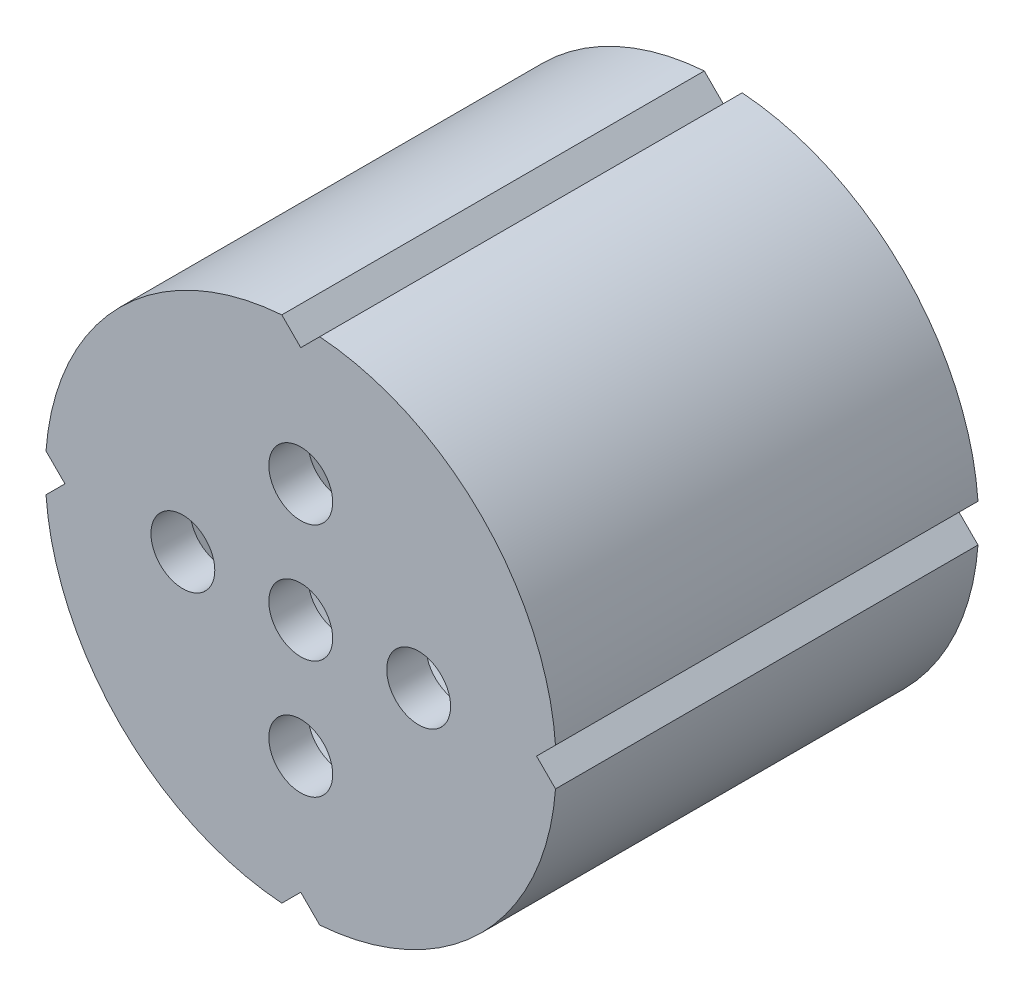
ISO-10303-21;
HEADER;
FILE_DESCRIPTION(('STEP AP214'),'2;1');
FILE_NAME('part.step','',(''),(''),'','','');
FILE_SCHEMA(('AUTOMOTIVE_DESIGN { 1 0 10303 214 1 1 1 1 }'));
ENDSEC;
DATA;
#1=APPLICATION_CONTEXT('core data for automotive mechanical design processes');
#2=APPLICATION_PROTOCOL_DEFINITION('international standard','automotive_design',2000,#1);
#3=PRODUCT_CONTEXT('',#1,'mechanical');
#4=PRODUCT('Part','Part','',(#3));
#5=PRODUCT_RELATED_PRODUCT_CATEGORY('part','',(#4));
#6=PRODUCT_DEFINITION_FORMATION('','',#4);
#7=PRODUCT_DEFINITION_CONTEXT('part definition',#1,'design');
#8=PRODUCT_DEFINITION('design','',#6,#7);
#9=PRODUCT_DEFINITION_SHAPE('','',#8);
#10=(LENGTH_UNIT() NAMED_UNIT(*) SI_UNIT(.MILLI.,.METRE.));
#11=(NAMED_UNIT(*) PLANE_ANGLE_UNIT() SI_UNIT($,.RADIAN.));
#12=(NAMED_UNIT(*) SI_UNIT($,.STERADIAN.) SOLID_ANGLE_UNIT());
#13=UNCERTAINTY_MEASURE_WITH_UNIT(LENGTH_MEASURE(1.E-05),#10,'distance_accuracy_value','');
#14=(GEOMETRIC_REPRESENTATION_CONTEXT(3) GLOBAL_UNCERTAINTY_ASSIGNED_CONTEXT((#13)) GLOBAL_UNIT_ASSIGNED_CONTEXT((#10,
#11,#12)) REPRESENTATION_CONTEXT('',''));
#15=CARTESIAN_POINT('',(0.,0.,0.));
#16=DIRECTION('',(0.,0.,1.));
#17=DIRECTION('',(1.,0.,0.));
#18=AXIS2_PLACEMENT_3D('',#15,#16,#17);
#19=CARTESIAN_POINT('',(0.,-12.0000000000006,-19.5));
#20=DIRECTION('',(0.707106781186548,-0.707106781186547,0.));
#21=DIRECTION('',(0.707106781186547,0.707106781186548,0.));
#22=AXIS2_PLACEMENT_3D('',#19,#20,#21);
#23=PLANE('',#22);
#24=DIRECTION('',(0.,0.,1.));
#25=VECTOR('',#24,1.);
#26=CARTESIAN_POINT('',(0.,-12.0000000000006,-19.5));
#27=LINE('',#26,#25);
#28=CARTESIAN_POINT('',(0.,-12.0000000000006,-19.5));
#29=VERTEX_POINT('',#28);
#30=CARTESIAN_POINT('',(0.,-12.0000000000006,2.));
#31=VERTEX_POINT('',#30);
#32=EDGE_CURVE('E36',#29,#31,#27,.T.);
#33=ORIENTED_EDGE('',*,*,#32,.T.);
#34=DIRECTION('',(0.707106781186547,0.707106781186548,0.));
#35=VECTOR('',#34,1.);
#36=CARTESIAN_POINT('',(-0.96419413859206,-12.9641941385926,2.));
#37=LINE('',#36,#35);
#38=CARTESIAN_POINT('',(-0.964194138592055,-12.9641941385926,2.));
#39=VERTEX_POINT('',#38);
#40=EDGE_CURVE('E160',#39,#31,#37,.T.);
#41=ORIENTED_EDGE('',*,*,#40,.F.);
#42=DIRECTION('',(0.,0.,1.));
#43=VECTOR('',#42,1.);
#44=CARTESIAN_POINT('',(-0.96419413859206,-12.9641941385926,-19.5));
#45=LINE('',#44,#43);
#46=CARTESIAN_POINT('',(-0.96419413859206,-12.9641941385926,-19.5));
#47=VERTEX_POINT('',#46);
#48=EDGE_CURVE('E11',#47,#39,#45,.T.);
#49=ORIENTED_EDGE('',*,*,#48,.F.);
#50=DIRECTION('',(0.707106781186547,0.707106781186548,0.));
#51=VECTOR('',#50,1.);
#52=CARTESIAN_POINT('',(0.,-12.0000000000006,-19.5));
#53=LINE('',#52,#51);
#54=EDGE_CURVE('E185',#47,#29,#53,.T.);
#55=ORIENTED_EDGE('',*,*,#54,.T.);
#56=EDGE_LOOP('',(#33,#41,#49,#55));
#57=FACE_BOUND('',#56,.T.);
#58=ADVANCED_FACE('F33',(#57),#23,.T.);
#59=CARTESIAN_POINT('',(0.,0.,-19.5));
#60=DIRECTION('',(0.,0.,1.));
#61=DIRECTION('',(1.,0.,0.));
#62=AXIS2_PLACEMENT_3D('',#59,#60,#61);
#63=CYLINDRICAL_SURFACE('',#62,13.0000000000006);
#64=ORIENTED_EDGE('',*,*,#48,.T.);
#65=CARTESIAN_POINT('',(0.,0.,2.));
#66=DIRECTION('',(0.,0.,1.));
#67=DIRECTION('',(-1.,0.,0.));
#68=AXIS2_PLACEMENT_3D('',#65,#66,#67);
#69=CIRCLE('',#68,13.0000000000006);
#70=CARTESIAN_POINT('',(-12.9641941385926,-0.964194138592061,2.));
#71=VERTEX_POINT('',#70);
#72=EDGE_CURVE('E157',#71,#39,#69,.T.);
#73=ORIENTED_EDGE('',*,*,#72,.F.);
#74=DIRECTION('',(0.,0.,1.));
#75=VECTOR('',#74,1.);
#76=CARTESIAN_POINT('',(-12.9641941385926,-0.964194138592061,-19.5));
#77=LINE('',#76,#75);
#78=CARTESIAN_POINT('',(-12.9641941385926,-0.964194138592061,-19.5));
#79=VERTEX_POINT('',#78);
#80=EDGE_CURVE('E41',#79,#71,#77,.T.);
#81=ORIENTED_EDGE('',*,*,#80,.F.);
#82=CARTESIAN_POINT('',(0.,0.,-19.5));
#83=DIRECTION('',(0.,0.,1.));
#84=DIRECTION('',(1.,0.,0.));
#85=AXIS2_PLACEMENT_3D('',#82,#83,#84);
#86=CIRCLE('',#85,13.0000000000006);
#87=EDGE_CURVE('E215',#79,#47,#86,.T.);
#88=ORIENTED_EDGE('',*,*,#87,.T.);
#89=EDGE_LOOP('',(#64,#73,#81,#88));
#90=FACE_BOUND('',#89,.T.);
#91=ADVANCED_FACE('F249',(#90),#63,.T.);
#92=CARTESIAN_POINT('',(-12.0000000000006,0.,-19.5));
#93=DIRECTION('',(-0.707106781186547,0.707106781186548,0.));
#94=DIRECTION('',(-0.707106781186548,-0.707106781186547,0.));
#95=AXIS2_PLACEMENT_3D('',#92,#93,#94);
#96=PLANE('',#95);
#97=ORIENTED_EDGE('',*,*,#80,.T.);
#98=DIRECTION('',(-0.707106781186548,-0.707106781186547,0.));
#99=VECTOR('',#98,1.);
#100=CARTESIAN_POINT('',(-12.9641941385926,-0.964194138592061,2.));
#101=LINE('',#100,#99);
#102=CARTESIAN_POINT('',(-12.0000000000006,0.,2.));
#103=VERTEX_POINT('',#102);
#104=EDGE_CURVE('E141',#103,#71,#101,.T.);
#105=ORIENTED_EDGE('',*,*,#104,.F.);
#106=DIRECTION('',(0.,0.,1.));
#107=VECTOR('',#106,1.);
#108=CARTESIAN_POINT('',(-12.0000000000006,0.,-19.5));
#109=LINE('',#108,#107);
#110=CARTESIAN_POINT('',(-12.0000000000006,0.,-19.5));
#111=VERTEX_POINT('',#110);
#112=EDGE_CURVE('E132',#111,#103,#109,.T.);
#113=ORIENTED_EDGE('',*,*,#112,.F.);
#114=DIRECTION('',(-0.707106781186548,-0.707106781186547,0.));
#115=VECTOR('',#114,1.);
#116=CARTESIAN_POINT('',(-12.0000000000006,0.,-19.5));
#117=LINE('',#116,#115);
#118=EDGE_CURVE('E213',#111,#79,#117,.T.);
#119=ORIENTED_EDGE('',*,*,#118,.T.);
#120=EDGE_LOOP('',(#97,#105,#113,#119));
#121=FACE_BOUND('',#120,.T.);
#122=ADVANCED_FACE('F253',(#121),#96,.T.);
#123=CARTESIAN_POINT('',(-12.9641941385926,0.964194138592062,-19.5));
#124=DIRECTION('',(-0.707106781186547,-0.707106781186548,0.));
#125=DIRECTION('',(0.707106781186548,-0.707106781186547,0.));
#126=AXIS2_PLACEMENT_3D('',#123,#124,#125);
#127=PLANE('',#126);
#128=ORIENTED_EDGE('',*,*,#112,.T.);
#129=DIRECTION('',(0.707106781186549,-0.707106781186546,0.));
#130=VECTOR('',#129,1.);
#131=CARTESIAN_POINT('',(-12.0000000000006,0.,2.));
#132=LINE('',#131,#130);
#133=CARTESIAN_POINT('',(-12.9641941385926,0.964194138592059,2.));
#134=VERTEX_POINT('',#133);
#135=EDGE_CURVE('E136',#134,#103,#132,.T.);
#136=ORIENTED_EDGE('',*,*,#135,.F.);
#137=DIRECTION('',(0.,0.,1.));
#138=VECTOR('',#137,1.);
#139=CARTESIAN_POINT('',(-12.9641941385926,0.964194138592059,-19.5));
#140=LINE('',#139,#138);
#141=CARTESIAN_POINT('',(-12.9641941385926,0.964194138592059,-19.5));
#142=VERTEX_POINT('',#141);
#143=EDGE_CURVE('E122',#142,#134,#140,.T.);
#144=ORIENTED_EDGE('',*,*,#143,.F.);
#145=DIRECTION('',(0.707106781186548,-0.707106781186547,0.));
#146=VECTOR('',#145,1.);
#147=CARTESIAN_POINT('',(-12.9641941385926,0.964194138592062,-19.5));
#148=LINE('',#147,#146);
#149=EDGE_CURVE('E211',#142,#111,#148,.T.);
#150=ORIENTED_EDGE('',*,*,#149,.T.);
#151=EDGE_LOOP('',(#128,#136,#144,#150));
#152=FACE_BOUND('',#151,.T.);
#153=ADVANCED_FACE('F137',(#152),#127,.T.);
#154=CARTESIAN_POINT('',(0.,0.,-19.5));
#155=DIRECTION('',(0.,0.,1.));
#156=DIRECTION('',(1.,0.,0.));
#157=AXIS2_PLACEMENT_3D('',#154,#155,#156);
#158=CYLINDRICAL_SURFACE('',#157,13.0000000000006);
#159=ORIENTED_EDGE('',*,*,#143,.T.);
#160=CARTESIAN_POINT('',(0.,0.,2.));
#161=DIRECTION('',(0.,0.,1.));
#162=DIRECTION('',(-1.,0.,0.));
#163=AXIS2_PLACEMENT_3D('',#160,#161,#162);
#164=CIRCLE('',#163,13.0000000000005);
#165=CARTESIAN_POINT('',(-0.964194138592062,12.9641941385926,2.));
#166=VERTEX_POINT('',#165);
#167=EDGE_CURVE('E126',#166,#134,#164,.T.);
#168=ORIENTED_EDGE('',*,*,#167,.F.);
#169=DIRECTION('',(0.,0.,1.));
#170=VECTOR('',#169,1.);
#171=CARTESIAN_POINT('',(-0.964194138592062,12.9641941385926,-19.5));
#172=LINE('',#171,#170);
#173=CARTESIAN_POINT('',(-0.964194138592062,12.9641941385926,-19.5));
#174=VERTEX_POINT('',#173);
#175=EDGE_CURVE('E133',#174,#166,#172,.T.);
#176=ORIENTED_EDGE('',*,*,#175,.F.);
#177=CARTESIAN_POINT('',(0.,0.,-19.5));
#178=DIRECTION('',(0.,0.,1.));
#179=DIRECTION('',(1.,0.,0.));
#180=AXIS2_PLACEMENT_3D('',#177,#178,#179);
#181=CIRCLE('',#180,13.0000000000006);
#182=EDGE_CURVE('E128',#174,#142,#181,.T.);
#183=ORIENTED_EDGE('',*,*,#182,.T.);
#184=EDGE_LOOP('',(#159,#168,#176,#183));
#185=FACE_BOUND('',#184,.T.);
#186=ADVANCED_FACE('F124',(#185),#158,.T.);
#187=CARTESIAN_POINT('',(-0.964194138592062,12.9641941385926,-19.5));
#188=DIRECTION('',(0.707106781186548,0.707106781186547,0.));
#189=DIRECTION('',(-0.707106781186547,0.707106781186548,0.));
#190=AXIS2_PLACEMENT_3D('',#187,#188,#189);
#191=PLANE('',#190);
#192=ORIENTED_EDGE('',*,*,#175,.T.);
#193=DIRECTION('',(-0.707106781186547,0.707106781186548,0.));
#194=VECTOR('',#193,1.);
#195=CARTESIAN_POINT('',(-0.964194138592062,12.9641941385926,2.));
#196=LINE('',#195,#194);
#197=CARTESIAN_POINT('',(0.,12.0000000000006,2.));
#198=VERTEX_POINT('',#197);
#199=EDGE_CURVE('E148',#198,#166,#196,.T.);
#200=ORIENTED_EDGE('',*,*,#199,.F.);
#201=DIRECTION('',(0.,0.,1.));
#202=VECTOR('',#201,1.);
#203=CARTESIAN_POINT('',(0.,12.0000000000006,-19.5));
#204=LINE('',#203,#202);
#205=CARTESIAN_POINT('',(0.,12.0000000000006,-19.5));
#206=VERTEX_POINT('',#205);
#207=EDGE_CURVE('E220',#206,#198,#204,.T.);
#208=ORIENTED_EDGE('',*,*,#207,.F.);
#209=DIRECTION('',(-0.707106781186547,0.707106781186548,0.));
#210=VECTOR('',#209,1.);
#211=CARTESIAN_POINT('',(-0.964194138592062,12.9641941385926,-19.5));
#212=LINE('',#211,#210);
#213=EDGE_CURVE('E207',#206,#174,#212,.T.);
#214=ORIENTED_EDGE('',*,*,#213,.T.);
#215=EDGE_LOOP('',(#192,#200,#208,#214));
#216=FACE_BOUND('',#215,.T.);
#217=ADVANCED_FACE('F266',(#216),#191,.T.);
#218=CARTESIAN_POINT('',(0.964194138592062,12.9641941385926,-19.5));
#219=DIRECTION('',(-0.707106781186548,0.707106781186547,0.));
#220=DIRECTION('',(-0.707106781186547,-0.707106781186548,0.));
#221=AXIS2_PLACEMENT_3D('',#218,#219,#220);
#222=PLANE('',#221);
#223=ORIENTED_EDGE('',*,*,#207,.T.);
#224=DIRECTION('',(-0.707106781186547,-0.707106781186548,0.));
#225=VECTOR('',#224,1.);
#226=CARTESIAN_POINT('',(0.,12.0000000000006,2.));
#227=LINE('',#226,#225);
#228=CARTESIAN_POINT('',(0.964194138592063,12.9641941385926,2.));
#229=VERTEX_POINT('',#228);
#230=EDGE_CURVE('E178',#229,#198,#227,.T.);
#231=ORIENTED_EDGE('',*,*,#230,.F.);
#232=DIRECTION('',(0.,0.,1.));
#233=VECTOR('',#232,1.);
#234=CARTESIAN_POINT('',(0.964194138592062,12.9641941385926,-19.5));
#235=LINE('',#234,#233);
#236=CARTESIAN_POINT('',(0.964194138592062,12.9641941385926,-19.5));
#237=VERTEX_POINT('',#236);
#238=EDGE_CURVE('E222',#237,#229,#235,.T.);
#239=ORIENTED_EDGE('',*,*,#238,.F.);
#240=DIRECTION('',(-0.707106781186547,-0.707106781186548,0.));
#241=VECTOR('',#240,1.);
#242=CARTESIAN_POINT('',(0.964194138592062,12.9641941385926,-19.5));
#243=LINE('',#242,#241);
#244=EDGE_CURVE('E204',#237,#206,#243,.T.);
#245=ORIENTED_EDGE('',*,*,#244,.T.);
#246=EDGE_LOOP('',(#223,#231,#239,#245));
#247=FACE_BOUND('',#246,.T.);
#248=ADVANCED_FACE('F269',(#247),#222,.T.);
#249=CARTESIAN_POINT('',(0.,0.,-19.5));
#250=DIRECTION('',(0.,0.,1.));
#251=DIRECTION('',(1.,0.,0.));
#252=AXIS2_PLACEMENT_3D('',#249,#250,#251);
#253=CYLINDRICAL_SURFACE('',#252,13.0000000000006);
#254=ORIENTED_EDGE('',*,*,#238,.T.);
#255=CARTESIAN_POINT('',(0.,0.,2.));
#256=DIRECTION('',(0.,0.,1.));
#257=DIRECTION('',(-1.,0.,0.));
#258=AXIS2_PLACEMENT_3D('',#255,#256,#257);
#259=CIRCLE('',#258,13.0000000000006);
#260=CARTESIAN_POINT('',(12.9641941385926,0.964194138592062,2.));
#261=VERTEX_POINT('',#260);
#262=EDGE_CURVE('E175',#261,#229,#259,.T.);
#263=ORIENTED_EDGE('',*,*,#262,.F.);
#264=DIRECTION('',(0.,0.,1.));
#265=VECTOR('',#264,1.);
#266=CARTESIAN_POINT('',(12.9641941385926,0.964194138592062,-19.5));
#267=LINE('',#266,#265);
#268=CARTESIAN_POINT('',(12.9641941385926,0.964194138592062,-19.5));
#269=VERTEX_POINT('',#268);
#270=EDGE_CURVE('E224',#269,#261,#267,.T.);
#271=ORIENTED_EDGE('',*,*,#270,.F.);
#272=CARTESIAN_POINT('',(0.,0.,-19.5));
#273=DIRECTION('',(0.,0.,1.));
#274=DIRECTION('',(1.,0.,0.));
#275=AXIS2_PLACEMENT_3D('',#272,#273,#274);
#276=CIRCLE('',#275,13.0000000000006);
#277=EDGE_CURVE('E201',#269,#237,#276,.T.);
#278=ORIENTED_EDGE('',*,*,#277,.T.);
#279=EDGE_LOOP('',(#254,#263,#271,#278));
#280=FACE_BOUND('',#279,.T.);
#281=ADVANCED_FACE('F273',(#280),#253,.T.);
#282=CARTESIAN_POINT('',(12.9641941385926,0.964194138592062,-19.5));
#283=DIRECTION('',(0.707106781186547,-0.707106781186548,0.));
#284=DIRECTION('',(0.707106781186548,0.707106781186547,0.));
#285=AXIS2_PLACEMENT_3D('',#282,#283,#284);
#286=PLANE('',#285);
#287=ORIENTED_EDGE('',*,*,#270,.T.);
#288=DIRECTION('',(0.707106781186548,0.707106781186547,0.));
#289=VECTOR('',#288,1.);
#290=CARTESIAN_POINT('',(12.0000000000006,0.,2.));
#291=LINE('',#290,#289);
#292=CARTESIAN_POINT('',(12.0000000000006,0.,2.));
#293=VERTEX_POINT('',#292);
#294=EDGE_CURVE('E172',#293,#261,#291,.T.);
#295=ORIENTED_EDGE('',*,*,#294,.F.);
#296=DIRECTION('',(0.,0.,1.));
#297=VECTOR('',#296,1.);
#298=CARTESIAN_POINT('',(12.0000000000006,0.,-19.5));
#299=LINE('',#298,#297);
#300=CARTESIAN_POINT('',(12.0000000000006,0.,-19.5));
#301=VERTEX_POINT('',#300);
#302=EDGE_CURVE('E226',#301,#293,#299,.T.);
#303=ORIENTED_EDGE('',*,*,#302,.F.);
#304=DIRECTION('',(0.707106781186548,0.707106781186547,0.));
#305=VECTOR('',#304,1.);
#306=CARTESIAN_POINT('',(12.9641941385926,0.964194138592062,-19.5));
#307=LINE('',#306,#305);
#308=EDGE_CURVE('E198',#301,#269,#307,.T.);
#309=ORIENTED_EDGE('',*,*,#308,.T.);
#310=EDGE_LOOP('',(#287,#295,#303,#309));
#311=FACE_BOUND('',#310,.T.);
#312=ADVANCED_FACE('F277',(#311),#286,.T.);
#313=CARTESIAN_POINT('',(12.9641941385926,-0.964194138592062,-19.5));
#314=DIRECTION('',(0.707106781186547,0.707106781186548,0.));
#315=DIRECTION('',(-0.707106781186548,0.707106781186547,0.));
#316=AXIS2_PLACEMENT_3D('',#313,#314,#315);
#317=PLANE('',#316);
#318=ORIENTED_EDGE('',*,*,#302,.T.);
#319=DIRECTION('',(-0.707106781186548,0.707106781186547,0.));
#320=VECTOR('',#319,1.);
#321=CARTESIAN_POINT('',(12.9641941385926,-0.964194138592061,2.));
#322=LINE('',#321,#320);
#323=CARTESIAN_POINT('',(12.9641941385926,-0.964194138592056,2.));
#324=VERTEX_POINT('',#323);
#325=EDGE_CURVE('E169',#324,#293,#322,.T.);
#326=ORIENTED_EDGE('',*,*,#325,.F.);
#327=DIRECTION('',(0.,0.,1.));
#328=VECTOR('',#327,1.);
#329=CARTESIAN_POINT('',(12.9641941385926,-0.964194138592061,-19.5));
#330=LINE('',#329,#328);
#331=CARTESIAN_POINT('',(12.9641941385926,-0.964194138592061,-19.5));
#332=VERTEX_POINT('',#331);
#333=EDGE_CURVE('E228',#332,#324,#330,.T.);
#334=ORIENTED_EDGE('',*,*,#333,.F.);
#335=DIRECTION('',(-0.707106781186548,0.707106781186547,0.));
#336=VECTOR('',#335,1.);
#337=CARTESIAN_POINT('',(12.9641941385926,-0.964194138592062,-19.5));
#338=LINE('',#337,#336);
#339=EDGE_CURVE('E195',#332,#301,#338,.T.);
#340=ORIENTED_EDGE('',*,*,#339,.T.);
#341=EDGE_LOOP('',(#318,#326,#334,#340));
#342=FACE_BOUND('',#341,.T.);
#343=ADVANCED_FACE('F245',(#342),#317,.T.);
#344=CARTESIAN_POINT('',(0.,0.,-19.5));
#345=DIRECTION('',(0.,0.,1.));
#346=DIRECTION('',(1.,0.,0.));
#347=AXIS2_PLACEMENT_3D('',#344,#345,#346);
#348=CYLINDRICAL_SURFACE('',#347,13.0000000000006);
#349=ORIENTED_EDGE('',*,*,#333,.T.);
#350=CARTESIAN_POINT('',(0.,0.,2.));
#351=DIRECTION('',(0.,0.,1.));
#352=DIRECTION('',(-1.,0.,0.));
#353=AXIS2_PLACEMENT_3D('',#350,#351,#352);
#354=CIRCLE('',#353,13.0000000000006);
#355=CARTESIAN_POINT('',(0.964194138592061,-12.9641941385926,2.));
#356=VERTEX_POINT('',#355);
#357=EDGE_CURVE('E166',#356,#324,#354,.T.);
#358=ORIENTED_EDGE('',*,*,#357,.F.);
#359=DIRECTION('',(0.,0.,1.));
#360=VECTOR('',#359,1.);
#361=CARTESIAN_POINT('',(0.964194138592061,-12.9641941385926,-19.5));
#362=LINE('',#361,#360);
#363=CARTESIAN_POINT('',(0.964194138592061,-12.9641941385926,-19.5));
#364=VERTEX_POINT('',#363);
#365=EDGE_CURVE('E229',#364,#356,#362,.T.);
#366=ORIENTED_EDGE('',*,*,#365,.F.);
#367=CARTESIAN_POINT('',(0.,0.,-19.5));
#368=DIRECTION('',(0.,0.,1.));
#369=DIRECTION('',(1.,0.,0.));
#370=AXIS2_PLACEMENT_3D('',#367,#368,#369);
#371=CIRCLE('',#370,13.0000000000006);
#372=EDGE_CURVE('E192',#364,#332,#371,.T.);
#373=ORIENTED_EDGE('',*,*,#372,.T.);
#374=EDGE_LOOP('',(#349,#358,#366,#373));
#375=FACE_BOUND('',#374,.T.);
#376=ADVANCED_FACE('F237',(#375),#348,.T.);
#377=CARTESIAN_POINT('',(0.964194138592061,-12.9641941385926,-19.5));
#378=DIRECTION('',(-0.707106781186548,-0.707106781186547,0.));
#379=DIRECTION('',(0.707106781186547,-0.707106781186548,0.));
#380=AXIS2_PLACEMENT_3D('',#377,#378,#379);
#381=PLANE('',#380);
#382=ORIENTED_EDGE('',*,*,#365,.T.);
#383=DIRECTION('',(0.707106781186547,-0.707106781186548,0.));
#384=VECTOR('',#383,1.);
#385=CARTESIAN_POINT('',(0.,-12.0000000000006,2.));
#386=LINE('',#385,#384);
#387=EDGE_CURVE('E163',#31,#356,#386,.T.);
#388=ORIENTED_EDGE('',*,*,#387,.F.);
#389=ORIENTED_EDGE('',*,*,#32,.F.);
#390=DIRECTION('',(0.707106781186547,-0.707106781186548,0.));
#391=VECTOR('',#390,1.);
#392=CARTESIAN_POINT('',(0.964194138592061,-12.9641941385926,-19.5));
#393=LINE('',#392,#391);
#394=EDGE_CURVE('E189',#29,#364,#393,.T.);
#395=ORIENTED_EDGE('',*,*,#394,.T.);
#396=EDGE_LOOP('',(#382,#388,#389,#395));
#397=FACE_BOUND('',#396,.T.);
#398=ADVANCED_FACE('F234',(#397),#381,.T.);
#399=CARTESIAN_POINT('',(0.,0.,-19.5));
#400=DIRECTION('',(0.,0.,1.));
#401=DIRECTION('',(1.,0.,0.));
#402=AXIS2_PLACEMENT_3D('',#399,#400,#401);
#403=PLANE('',#402);
#404=CARTESIAN_POINT('',(0.,0.,-19.5));
#405=DIRECTION('',(0.,0.,1.));
#406=DIRECTION('',(1.,0.,0.));
#407=AXIS2_PLACEMENT_3D('',#404,#405,#406);
#408=CIRCLE('',#407,11.5000000000006);
#409=CARTESIAN_POINT('',(11.5000000000006,0.,-19.5));
#410=VERTEX_POINT('',#409);
#411=EDGE_CURVE('E182',#410,#410,#408,.T.);
#412=ORIENTED_EDGE('',*,*,#411,.T.);
#413=EDGE_LOOP('',(#412));
#414=FACE_BOUND('',#413,.T.);
#415=ORIENTED_EDGE('',*,*,#54,.F.);
#416=ORIENTED_EDGE('',*,*,#87,.F.);
#417=ORIENTED_EDGE('',*,*,#118,.F.);
#418=ORIENTED_EDGE('',*,*,#149,.F.);
#419=ORIENTED_EDGE('',*,*,#182,.F.);
#420=ORIENTED_EDGE('',*,*,#213,.F.);
#421=ORIENTED_EDGE('',*,*,#244,.F.);
#422=ORIENTED_EDGE('',*,*,#277,.F.);
#423=ORIENTED_EDGE('',*,*,#308,.F.);
#424=ORIENTED_EDGE('',*,*,#339,.F.);
#425=ORIENTED_EDGE('',*,*,#372,.F.);
#426=ORIENTED_EDGE('',*,*,#394,.F.);
#427=EDGE_LOOP('',(#415,#416,#417,#418,#419,#420,#421,#422,#423,#424,#425,#426));
#428=FACE_BOUND('',#427,.T.);
#429=ADVANCED_FACE('F236',(#414,#428),#403,.F.);
#430=CARTESIAN_POINT('',(0.,0.,-19.5));
#431=DIRECTION('',(0.,0.,1.));
#432=DIRECTION('',(1.,0.,0.));
#433=AXIS2_PLACEMENT_3D('',#430,#431,#432);
#434=CYLINDRICAL_SURFACE('',#433,11.5000000000006);
#435=ORIENTED_EDGE('',*,*,#411,.F.);
#436=EDGE_LOOP('',(#435));
#437=FACE_BOUND('',#436,.T.);
#438=CARTESIAN_POINT('',(0.,0.,0.));
#439=DIRECTION('',(0.,0.,1.));
#440=DIRECTION('',(1.,0.,0.));
#441=AXIS2_PLACEMENT_3D('',#438,#439,#440);
#442=CIRCLE('',#441,11.5000000000006);
#443=CARTESIAN_POINT('',(11.5000000000006,0.,0.));
#444=VERTEX_POINT('',#443);
#445=EDGE_CURVE('E181',#444,#444,#442,.T.);
#446=ORIENTED_EDGE('',*,*,#445,.T.);
#447=EDGE_LOOP('',(#446));
#448=FACE_BOUND('',#447,.T.);
#449=ADVANCED_FACE('F242',(#437,#448),#434,.F.);
#450=CARTESIAN_POINT('',(0.,0.,0.));
#451=DIRECTION('',(0.,0.,-1.));
#452=DIRECTION('',(-1.,0.,0.));
#453=AXIS2_PLACEMENT_3D('',#450,#451,#452);
#454=PLANE('',#453);
#455=CARTESIAN_POINT('',(0.,-6.,0.));
#456=DIRECTION('',(0.,0.,1.));
#457=DIRECTION('',(1.,0.,0.));
#458=AXIS2_PLACEMENT_3D('',#455,#456,#457);
#459=CIRCLE('',#458,1.625);
#460=CARTESIAN_POINT('',(1.625,-6.,0.));
#461=VERTEX_POINT('',#460);
#462=EDGE_CURVE('E491',#461,#461,#459,.T.);
#463=ORIENTED_EDGE('',*,*,#462,.T.);
#464=EDGE_LOOP('',(#463));
#465=FACE_BOUND('',#464,.T.);
#466=CARTESIAN_POINT('',(6.,0.,0.));
#467=DIRECTION('',(0.,0.,1.));
#468=DIRECTION('',(1.,0.,0.));
#469=AXIS2_PLACEMENT_3D('',#466,#467,#468);
#470=CIRCLE('',#469,1.625);
#471=CARTESIAN_POINT('',(7.625,0.,0.));
#472=VERTEX_POINT('',#471);
#473=EDGE_CURVE('E499',#472,#472,#470,.T.);
#474=ORIENTED_EDGE('',*,*,#473,.T.);
#475=EDGE_LOOP('',(#474));
#476=FACE_BOUND('',#475,.T.);
#477=CARTESIAN_POINT('',(-6.,0.,0.));
#478=DIRECTION('',(0.,0.,1.));
#479=DIRECTION('',(1.,0.,0.));
#480=AXIS2_PLACEMENT_3D('',#477,#478,#479);
#481=CIRCLE('',#480,1.625);
#482=CARTESIAN_POINT('',(-4.375,0.,0.));
#483=VERTEX_POINT('',#482);
#484=EDGE_CURVE('E152',#483,#483,#481,.T.);
#485=ORIENTED_EDGE('',*,*,#484,.T.);
#486=EDGE_LOOP('',(#485));
#487=FACE_BOUND('',#486,.T.);
#488=CARTESIAN_POINT('',(0.,0.,0.));
#489=DIRECTION('',(0.,0.,1.));
#490=DIRECTION('',(1.,0.,0.));
#491=AXIS2_PLACEMENT_3D('',#488,#489,#490);
#492=CIRCLE('',#491,1.62500000000011);
#493=CARTESIAN_POINT('',(1.62500000000011,0.,0.));
#494=VERTEX_POINT('',#493);
#495=EDGE_CURVE('E505',#494,#494,#492,.T.);
#496=ORIENTED_EDGE('',*,*,#495,.T.);
#497=EDGE_LOOP('',(#496));
#498=FACE_BOUND('',#497,.T.);
#499=CARTESIAN_POINT('',(0.,6.,0.));
#500=DIRECTION('',(0.,0.,1.));
#501=DIRECTION('',(1.,0.,0.));
#502=AXIS2_PLACEMENT_3D('',#499,#500,#501);
#503=CIRCLE('',#502,1.625);
#504=CARTESIAN_POINT('',(1.625,6.,0.));
#505=VERTEX_POINT('',#504);
#506=EDGE_CURVE('E493',#505,#505,#503,.T.);
#507=ORIENTED_EDGE('',*,*,#506,.T.);
#508=EDGE_LOOP('',(#507));
#509=FACE_BOUND('',#508,.T.);
#510=ORIENTED_EDGE('',*,*,#445,.F.);
#511=EDGE_LOOP('',(#510));
#512=FACE_BOUND('',#511,.T.);
#513=ADVANCED_FACE('F317',(#465,#476,#487,#498,#509,#512),#454,.T.);
#514=CARTESIAN_POINT('',(0.,0.,2.));
#515=DIRECTION('',(0.,0.,-1.));
#516=DIRECTION('',(-1.,0.,0.));
#517=AXIS2_PLACEMENT_3D('',#514,#515,#516);
#518=PLANE('',#517);
#519=ORIENTED_EDGE('',*,*,#167,.T.);
#520=ORIENTED_EDGE('',*,*,#135,.T.);
#521=ORIENTED_EDGE('',*,*,#104,.T.);
#522=ORIENTED_EDGE('',*,*,#72,.T.);
#523=ORIENTED_EDGE('',*,*,#40,.T.);
#524=ORIENTED_EDGE('',*,*,#387,.T.);
#525=ORIENTED_EDGE('',*,*,#357,.T.);
#526=ORIENTED_EDGE('',*,*,#325,.T.);
#527=ORIENTED_EDGE('',*,*,#294,.T.);
#528=ORIENTED_EDGE('',*,*,#262,.T.);
#529=ORIENTED_EDGE('',*,*,#230,.T.);
#530=ORIENTED_EDGE('',*,*,#199,.T.);
#531=EDGE_LOOP('',(#519,#520,#521,#522,#523,#524,#525,#526,#527,#528,#529,#530));
#532=FACE_BOUND('',#531,.T.);
#533=CARTESIAN_POINT('',(-6.,0.,2.));
#534=DIRECTION('',(0.,0.,1.));
#535=DIRECTION('',(1.,0.,0.));
#536=AXIS2_PLACEMENT_3D('',#533,#534,#535);
#537=CIRCLE('',#536,1.625);
#538=CARTESIAN_POINT('',(-4.375,0.,2.));
#539=VERTEX_POINT('',#538);
#540=EDGE_CURVE('E149',#539,#539,#537,.T.);
#541=ORIENTED_EDGE('',*,*,#540,.F.);
#542=EDGE_LOOP('',(#541));
#543=FACE_BOUND('',#542,.T.);
#544=CARTESIAN_POINT('',(0.,0.,2.));
#545=DIRECTION('',(0.,0.,1.));
#546=DIRECTION('',(1.,0.,0.));
#547=AXIS2_PLACEMENT_3D('',#544,#545,#546);
#548=CIRCLE('',#547,1.62500000000011);
#549=CARTESIAN_POINT('',(1.62500000000011,0.,2.));
#550=VERTEX_POINT('',#549);
#551=EDGE_CURVE('E508',#550,#550,#548,.T.);
#552=ORIENTED_EDGE('',*,*,#551,.F.);
#553=EDGE_LOOP('',(#552));
#554=FACE_BOUND('',#553,.T.);
#555=CARTESIAN_POINT('',(6.,0.,2.));
#556=DIRECTION('',(0.,0.,1.));
#557=DIRECTION('',(1.,0.,0.));
#558=AXIS2_PLACEMENT_3D('',#555,#556,#557);
#559=CIRCLE('',#558,1.625);
#560=CARTESIAN_POINT('',(7.625,0.,2.));
#561=VERTEX_POINT('',#560);
#562=EDGE_CURVE('E502',#561,#561,#559,.T.);
#563=ORIENTED_EDGE('',*,*,#562,.F.);
#564=EDGE_LOOP('',(#563));
#565=FACE_BOUND('',#564,.T.);
#566=CARTESIAN_POINT('',(0.,6.,2.));
#567=DIRECTION('',(0.,0.,1.));
#568=DIRECTION('',(1.,0.,0.));
#569=AXIS2_PLACEMENT_3D('',#566,#567,#568);
#570=CIRCLE('',#569,1.625);
#571=CARTESIAN_POINT('',(1.625,6.,2.));
#572=VERTEX_POINT('',#571);
#573=EDGE_CURVE('E496',#572,#572,#570,.T.);
#574=ORIENTED_EDGE('',*,*,#573,.F.);
#575=EDGE_LOOP('',(#574));
#576=FACE_BOUND('',#575,.T.);
#577=CARTESIAN_POINT('',(0.,-6.,2.));
#578=DIRECTION('',(0.,0.,1.));
#579=DIRECTION('',(1.,0.,0.));
#580=AXIS2_PLACEMENT_3D('',#577,#578,#579);
#581=CIRCLE('',#580,1.625);
#582=CARTESIAN_POINT('',(1.625,-6.,2.));
#583=VERTEX_POINT('',#582);
#584=EDGE_CURVE('E488',#583,#583,#581,.T.);
#585=ORIENTED_EDGE('',*,*,#584,.F.);
#586=EDGE_LOOP('',(#585));
#587=FACE_BOUND('',#586,.T.);
#588=ADVANCED_FACE('F144',(#532,#543,#554,#565,#576,#587),#518,.F.);
#589=CARTESIAN_POINT('',(-6.,0.,2.));
#590=DIRECTION('',(0.,0.,-1.));
#591=DIRECTION('',(-1.,0.,0.));
#592=AXIS2_PLACEMENT_3D('',#589,#590,#591);
#593=CYLINDRICAL_SURFACE('',#592,1.625);
#594=ORIENTED_EDGE('',*,*,#540,.T.);
#595=EDGE_LOOP('',(#594));
#596=FACE_BOUND('',#595,.T.);
#597=ORIENTED_EDGE('',*,*,#484,.F.);
#598=EDGE_LOOP('',(#597));
#599=FACE_BOUND('',#598,.T.);
#600=ADVANCED_FACE('F331',(#596,#599),#593,.F.);
#601=CARTESIAN_POINT('',(0.,0.,2.));
#602=DIRECTION('',(0.,0.,-1.));
#603=DIRECTION('',(-1.,0.,0.));
#604=AXIS2_PLACEMENT_3D('',#601,#602,#603);
#605=CYLINDRICAL_SURFACE('',#604,1.62500000000011);
#606=ORIENTED_EDGE('',*,*,#551,.T.);
#607=EDGE_LOOP('',(#606));
#608=FACE_BOUND('',#607,.T.);
#609=ORIENTED_EDGE('',*,*,#495,.F.);
#610=EDGE_LOOP('',(#609));
#611=FACE_BOUND('',#610,.T.);
#612=ADVANCED_FACE('F340',(#608,#611),#605,.F.);
#613=CARTESIAN_POINT('',(6.,0.,2.));
#614=DIRECTION('',(0.,0.,-1.));
#615=DIRECTION('',(-1.,0.,0.));
#616=AXIS2_PLACEMENT_3D('',#613,#614,#615);
#617=CYLINDRICAL_SURFACE('',#616,1.625);
#618=ORIENTED_EDGE('',*,*,#562,.T.);
#619=EDGE_LOOP('',(#618));
#620=FACE_BOUND('',#619,.T.);
#621=ORIENTED_EDGE('',*,*,#473,.F.);
#622=EDGE_LOOP('',(#621));
#623=FACE_BOUND('',#622,.T.);
#624=ADVANCED_FACE('F350',(#620,#623),#617,.F.);
#625=CARTESIAN_POINT('',(0.,6.,2.));
#626=DIRECTION('',(0.,0.,-1.));
#627=DIRECTION('',(-1.,0.,0.));
#628=AXIS2_PLACEMENT_3D('',#625,#626,#627);
#629=CYLINDRICAL_SURFACE('',#628,1.625);
#630=ORIENTED_EDGE('',*,*,#573,.T.);
#631=EDGE_LOOP('',(#630));
#632=FACE_BOUND('',#631,.T.);
#633=ORIENTED_EDGE('',*,*,#506,.F.);
#634=EDGE_LOOP('',(#633));
#635=FACE_BOUND('',#634,.T.);
#636=ADVANCED_FACE('F360',(#632,#635),#629,.F.);
#637=CARTESIAN_POINT('',(0.,-6.,2.));
#638=DIRECTION('',(0.,0.,-1.));
#639=DIRECTION('',(-1.,0.,0.));
#640=AXIS2_PLACEMENT_3D('',#637,#638,#639);
#641=CYLINDRICAL_SURFACE('',#640,1.625);
#642=ORIENTED_EDGE('',*,*,#584,.T.);
#643=EDGE_LOOP('',(#642));
#644=FACE_BOUND('',#643,.T.);
#645=ORIENTED_EDGE('',*,*,#462,.F.);
#646=EDGE_LOOP('',(#645));
#647=FACE_BOUND('',#646,.T.);
#648=ADVANCED_FACE('F370',(#644,#647),#641,.F.);
#649=CLOSED_SHELL('',(#58,#91,#122,#153,#186,#217,#248,#281,#312,#343,#376,#398,#429,#449,#513,
#588,#600,#612,#624,#636,#648));
#650=MANIFOLD_SOLID_BREP('B2',#649);
#651=ADVANCED_BREP_SHAPE_REPRESENTATION('',(#18,#650),#14);
#652=SHAPE_DEFINITION_REPRESENTATION(#9,#651);
ENDSEC;
END-ISO-10303-21;
